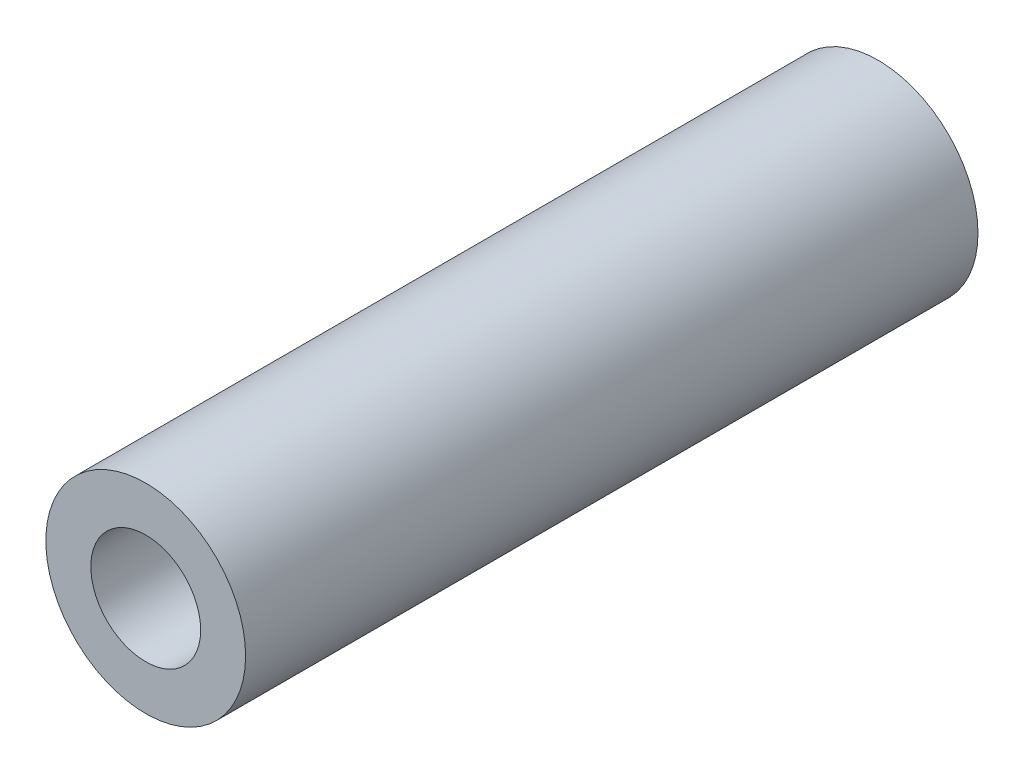
ISO-10303-21;
HEADER;
FILE_DESCRIPTION(('STEP AP214'),'2;1');
FILE_NAME('part.step','',(''),(''),'','','');
FILE_SCHEMA(('AUTOMOTIVE_DESIGN { 1 0 10303 214 1 1 1 1 }'));
ENDSEC;
DATA;
#1=APPLICATION_CONTEXT('core data for automotive mechanical design processes');
#2=APPLICATION_PROTOCOL_DEFINITION('international standard','automotive_design',2000,#1);
#3=PRODUCT_CONTEXT('',#1,'mechanical');
#4=PRODUCT('Part','Part','',(#3));
#5=PRODUCT_RELATED_PRODUCT_CATEGORY('part','',(#4));
#6=PRODUCT_DEFINITION_FORMATION('','',#4);
#7=PRODUCT_DEFINITION_CONTEXT('part definition',#1,'design');
#8=PRODUCT_DEFINITION('design','',#6,#7);
#9=PRODUCT_DEFINITION_SHAPE('','',#8);
#10=(LENGTH_UNIT() NAMED_UNIT(*) SI_UNIT(.MILLI.,.METRE.));
#11=(NAMED_UNIT(*) PLANE_ANGLE_UNIT() SI_UNIT($,.RADIAN.));
#12=(NAMED_UNIT(*) SI_UNIT($,.STERADIAN.) SOLID_ANGLE_UNIT());
#13=UNCERTAINTY_MEASURE_WITH_UNIT(LENGTH_MEASURE(1.E-05),#10,'distance_accuracy_value','');
#14=(GEOMETRIC_REPRESENTATION_CONTEXT(3) GLOBAL_UNCERTAINTY_ASSIGNED_CONTEXT((#13)) GLOBAL_UNIT_ASSIGNED_CONTEXT((#10,
#11,#12)) REPRESENTATION_CONTEXT('',''));
#15=CARTESIAN_POINT('',(0.,0.,0.));
#16=DIRECTION('',(0.,0.,1.));
#17=DIRECTION('',(1.,0.,0.));
#18=AXIS2_PLACEMENT_3D('',#15,#16,#17);
#19=CARTESIAN_POINT('',(0.,0.,22.));
#20=DIRECTION('',(0.,0.,1.));
#21=DIRECTION('',(1.,0.,0.));
#22=AXIS2_PLACEMENT_3D('',#19,#20,#21);
#23=PLANE('',#22);
#24=CARTESIAN_POINT('',(0.,0.,22.));
#25=DIRECTION('',(0.,0.,1.));
#26=DIRECTION('',(1.,0.,0.));
#27=AXIS2_PLACEMENT_3D('',#24,#25,#26);
#28=CIRCLE('',#27,3.);
#29=CARTESIAN_POINT('',(3.,0.,22.));
#30=VERTEX_POINT('',#29);
#31=EDGE_CURVE('E10',#30,#30,#28,.T.);
#32=ORIENTED_EDGE('',*,*,#31,.T.);
#33=EDGE_LOOP('',(#32));
#34=FACE_BOUND('',#33,.T.);
#35=CARTESIAN_POINT('',(0.,0.,22.));
#36=DIRECTION('',(0.,0.,1.));
#37=DIRECTION('',(1.,0.,0.));
#38=AXIS2_PLACEMENT_3D('',#35,#36,#37);
#39=CIRCLE('',#38,1.65);
#40=CARTESIAN_POINT('',(1.65,0.,22.));
#41=VERTEX_POINT('',#40);
#42=EDGE_CURVE('E48',#41,#41,#39,.T.);
#43=ORIENTED_EDGE('',*,*,#42,.F.);
#44=EDGE_LOOP('',(#43));
#45=FACE_BOUND('',#44,.T.);
#46=ADVANCED_FACE('F37',(#34,#45),#23,.T.);
#47=CARTESIAN_POINT('',(0.,0.,0.));
#48=DIRECTION('',(0.,0.,1.));
#49=DIRECTION('',(1.,0.,0.));
#50=AXIS2_PLACEMENT_3D('',#47,#48,#49);
#51=PLANE('',#50);
#52=CARTESIAN_POINT('',(0.,0.,0.));
#53=DIRECTION('',(0.,0.,1.));
#54=DIRECTION('',(1.,0.,0.));
#55=AXIS2_PLACEMENT_3D('',#52,#53,#54);
#56=CIRCLE('',#55,3.);
#57=CARTESIAN_POINT('',(3.,0.,0.));
#58=VERTEX_POINT('',#57);
#59=EDGE_CURVE('E41',#58,#58,#56,.T.);
#60=ORIENTED_EDGE('',*,*,#59,.F.);
#61=EDGE_LOOP('',(#60));
#62=FACE_BOUND('',#61,.T.);
#63=CARTESIAN_POINT('',(0.,0.,0.));
#64=DIRECTION('',(0.,0.,1.));
#65=DIRECTION('',(1.,0.,0.));
#66=AXIS2_PLACEMENT_3D('',#63,#64,#65);
#67=CIRCLE('',#66,1.65);
#68=CARTESIAN_POINT('',(1.65,0.,0.));
#69=VERTEX_POINT('',#68);
#70=EDGE_CURVE('E50',#69,#69,#67,.T.);
#71=ORIENTED_EDGE('',*,*,#70,.T.);
#72=EDGE_LOOP('',(#71));
#73=FACE_BOUND('',#72,.T.);
#74=ADVANCED_FACE('F60',(#62,#73),#51,.F.);
#75=CARTESIAN_POINT('',(0.,0.,22.));
#76=DIRECTION('',(0.,0.,-1.));
#77=DIRECTION('',(-1.,0.,0.));
#78=AXIS2_PLACEMENT_3D('',#75,#76,#77);
#79=CYLINDRICAL_SURFACE('',#78,3.);
#80=ORIENTED_EDGE('',*,*,#31,.F.);
#81=EDGE_LOOP('',(#80));
#82=FACE_BOUND('',#81,.T.);
#83=ORIENTED_EDGE('',*,*,#59,.T.);
#84=EDGE_LOOP('',(#83));
#85=FACE_BOUND('',#84,.T.);
#86=ADVANCED_FACE('F39',(#82,#85),#79,.T.);
#87=CARTESIAN_POINT('',(0.,0.,22.));
#88=DIRECTION('',(0.,0.,-1.));
#89=DIRECTION('',(-1.,0.,0.));
#90=AXIS2_PLACEMENT_3D('',#87,#88,#89);
#91=CYLINDRICAL_SURFACE('',#90,1.65);
#92=ORIENTED_EDGE('',*,*,#42,.T.);
#93=EDGE_LOOP('',(#92));
#94=FACE_BOUND('',#93,.T.);
#95=ORIENTED_EDGE('',*,*,#70,.F.);
#96=EDGE_LOOP('',(#95));
#97=FACE_BOUND('',#96,.T.);
#98=ADVANCED_FACE('F56',(#94,#97),#91,.F.);
#99=CLOSED_SHELL('',(#46,#74,#86,#98));
#100=MANIFOLD_SOLID_BREP('B2',#99);
#101=ADVANCED_BREP_SHAPE_REPRESENTATION('',(#18,#100),#14);
#102=SHAPE_DEFINITION_REPRESENTATION(#9,#101);
ENDSEC;
END-ISO-10303-21;
